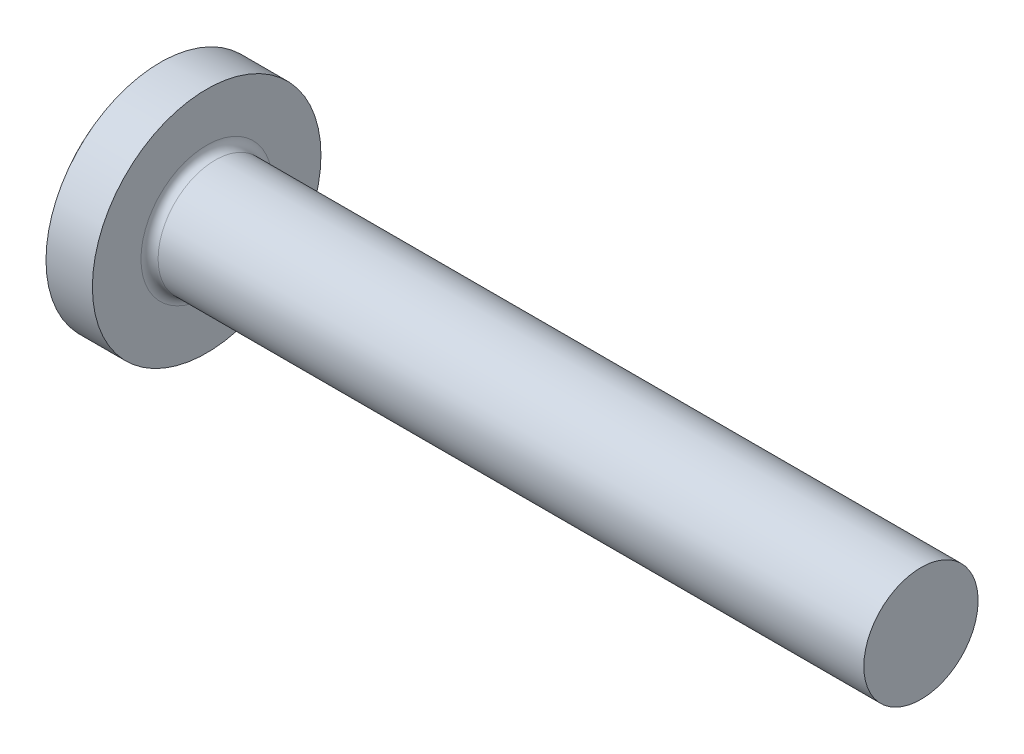
ISO-10303-21;
HEADER;
FILE_DESCRIPTION(('STEP AP214'),'2;1');
FILE_NAME('part.step','',(''),(''),'','','');
FILE_SCHEMA(('AUTOMOTIVE_DESIGN { 1 0 10303 214 1 1 1 1 }'));
ENDSEC;
DATA;
#1=APPLICATION_CONTEXT('core data for automotive mechanical design processes');
#2=APPLICATION_PROTOCOL_DEFINITION('international standard','automotive_design',2000,#1);
#3=PRODUCT_CONTEXT('',#1,'mechanical');
#4=PRODUCT('Part','Part','',(#3));
#5=PRODUCT_RELATED_PRODUCT_CATEGORY('part','',(#4));
#6=PRODUCT_DEFINITION_FORMATION('','',#4);
#7=PRODUCT_DEFINITION_CONTEXT('part definition',#1,'design');
#8=PRODUCT_DEFINITION('design','',#6,#7);
#9=PRODUCT_DEFINITION_SHAPE('','',#8);
#10=(LENGTH_UNIT() NAMED_UNIT(*) SI_UNIT(.MILLI.,.METRE.));
#11=(NAMED_UNIT(*) PLANE_ANGLE_UNIT() SI_UNIT($,.RADIAN.));
#12=(NAMED_UNIT(*) SI_UNIT($,.STERADIAN.) SOLID_ANGLE_UNIT());
#13=UNCERTAINTY_MEASURE_WITH_UNIT(LENGTH_MEASURE(1.E-05),#10,'distance_accuracy_value','');
#14=(GEOMETRIC_REPRESENTATION_CONTEXT(3) GLOBAL_UNCERTAINTY_ASSIGNED_CONTEXT((#13)) GLOBAL_UNIT_ASSIGNED_CONTEXT((#10,
#11,#12)) REPRESENTATION_CONTEXT('',''));
#15=CARTESIAN_POINT('',(0.,0.,0.));
#16=DIRECTION('',(0.,0.,1.));
#17=DIRECTION('',(1.,0.,0.));
#18=AXIS2_PLACEMENT_3D('',#15,#16,#17);
#19=CARTESIAN_POINT('',(13.,0.,0.));
#20=DIRECTION('',(-1.,0.,0.));
#21=DIRECTION('',(0.,1.,0.));
#22=AXIS2_PLACEMENT_3D('',#19,#20,#21);
#23=SPHERICAL_SURFACE('',#22,13.);
#24=CARTESIAN_POINT('',(2.7530492340404,0.,0.));
#25=DIRECTION('',(-1.,0.,0.));
#26=DIRECTION('',(0.,0.,1.));
#27=AXIS2_PLACEMENT_3D('',#24,#25,#26);
#28=CIRCLE('',#27,8.);
#29=CARTESIAN_POINT('',(2.7530492340404,0.,8.));
#30=VERTEX_POINT('',#29);
#31=EDGE_CURVE('E820',#30,#30,#28,.T.);
#32=ORIENTED_EDGE('',*,*,#31,.T.);
#33=EDGE_LOOP('',(#32));
#34=FACE_BOUND('',#33,.T.);
#35=CARTESIAN_POINT('',(0.173606813349381,0.,0.));
#36=DIRECTION('',(1.,0.,0.));
#37=DIRECTION('',(0.,0.,-1.));
#38=AXIS2_PLACEMENT_3D('',#35,#36,#37);
#39=CIRCLE('',#38,2.11746022901081);
#40=CARTESIAN_POINT('',(0.173606813349539,-0.967999999999993,-1.88324555527021));
#41=VERTEX_POINT('',#40);
#42=CARTESIAN_POINT('',(0.173606813349381,-1.88324555526955,-0.968));
#43=VERTEX_POINT('',#42);
#44=EDGE_CURVE('E621',#41,#43,#39,.F.);
#45=ORIENTED_EDGE('',*,*,#44,.F.);
#46=CARTESIAN_POINT('',(13.,-0.968000000000001,0.));
#47=DIRECTION('',(0.,1.,0.));
#48=DIRECTION('',(0.,0.,1.));
#49=AXIS2_PLACEMENT_3D('',#46,#47,#48);
#50=CIRCLE('',#49,12.9639105211352);
#51=CARTESIAN_POINT('',(0.687351995855913,-0.967999999999985,-4.05729899391783));
#52=VERTEX_POINT('',#51);
#53=EDGE_CURVE('E530',#52,#41,#50,.T.);
#54=ORIENTED_EDGE('',*,*,#53,.F.);
#55=CARTESIAN_POINT('',(12.1687962890756,0.,1.66713700726554));
#56=DIRECTION('',(-0.446197753347436,0.,0.894934391398443));
#57=DIRECTION('',(0.894934391398443,0.,0.446197753347436));
#58=AXIS2_PLACEMENT_3D('',#55,#56,#57);
#59=CIRCLE('',#58,12.8658367232742);
#60=CARTESIAN_POINT('',(0.687351995855914,0.968000000000017,-4.05729899391782));
#61=VERTEX_POINT('',#60);
#62=EDGE_CURVE('E61',#61,#52,#59,.T.);
#63=ORIENTED_EDGE('',*,*,#62,.F.);
#64=CARTESIAN_POINT('',(13.,0.968,0.));
#65=DIRECTION('',(0.,-1.,0.));
#66=DIRECTION('',(0.,0.,-1.));
#67=AXIS2_PLACEMENT_3D('',#64,#65,#66);
#68=CIRCLE('',#67,12.9639105211352);
#69=CARTESIAN_POINT('',(0.173606813349538,0.968000000000006,-1.8832455552702));
#70=VERTEX_POINT('',#69);
#71=EDGE_CURVE('E522',#70,#61,#68,.T.);
#72=ORIENTED_EDGE('',*,*,#71,.F.);
#73=CARTESIAN_POINT('',(0.173606813349381,1.88324555526955,-0.968));
#74=VERTEX_POINT('',#73);
#75=EDGE_CURVE('E362',#74,#70,#39,.F.);
#76=ORIENTED_EDGE('',*,*,#75,.F.);
#77=CARTESIAN_POINT('',(13.,0.,-0.968));
#78=DIRECTION('',(0.,0.,1.));
#79=DIRECTION('',(1.,0.,0.));
#80=AXIS2_PLACEMENT_3D('',#77,#78,#79);
#81=CIRCLE('',#80,12.9639105211352);
#82=CARTESIAN_POINT('',(0.687351995855913,4.05729899391782,-0.968));
#83=VERTEX_POINT('',#82);
#84=EDGE_CURVE('E636',#83,#74,#81,.T.);
#85=ORIENTED_EDGE('',*,*,#84,.F.);
#86=CARTESIAN_POINT('',(12.1687962890756,-1.66713700726554,0.));
#87=DIRECTION('',(-0.446197753347436,-0.894934391398443,0.));
#88=DIRECTION('',(0.894934391398443,-0.446197753347436,0.));
#89=AXIS2_PLACEMENT_3D('',#86,#87,#88);
#90=CIRCLE('',#89,12.8658367232742);
#91=CARTESIAN_POINT('',(0.687351995855913,4.05729899391782,0.968000000000001));
#92=VERTEX_POINT('',#91);
#93=EDGE_CURVE('E637',#92,#83,#90,.T.);
#94=ORIENTED_EDGE('',*,*,#93,.F.);
#95=CARTESIAN_POINT('',(13.,0.,0.968000000000001));
#96=DIRECTION('',(0.,0.,-1.));
#97=DIRECTION('',(0.,1.,0.));
#98=AXIS2_PLACEMENT_3D('',#95,#96,#97);
#99=CIRCLE('',#98,12.9639105211352);
#100=CARTESIAN_POINT('',(0.173606813349381,1.88324555526955,0.968));
#101=VERTEX_POINT('',#100);
#102=EDGE_CURVE('E77',#101,#92,#99,.T.);
#103=ORIENTED_EDGE('',*,*,#102,.F.);
#104=CARTESIAN_POINT('',(0.173606813349538,0.967999999999993,1.88324555527021));
#105=VERTEX_POINT('',#104);
#106=EDGE_CURVE('E598',#105,#101,#39,.F.);
#107=ORIENTED_EDGE('',*,*,#106,.F.);
#108=CARTESIAN_POINT('',(0.687351995855913,0.967999999999986,4.05729899391783));
#109=VERTEX_POINT('',#108);
#110=EDGE_CURVE('E534',#109,#105,#68,.T.);
#111=ORIENTED_EDGE('',*,*,#110,.F.);
#112=CARTESIAN_POINT('',(12.1687962890756,0.,-1.66713700726554));
#113=DIRECTION('',(-0.446197753347436,0.,-0.894934391398443));
#114=DIRECTION('',(-0.894934391398443,0.,0.446197753347436));
#115=AXIS2_PLACEMENT_3D('',#112,#113,#114);
#116=CIRCLE('',#115,12.8658367232742);
#117=CARTESIAN_POINT('',(0.687351995855913,-0.968000000000015,4.05729899391782));
#118=VERTEX_POINT('',#117);
#119=EDGE_CURVE('E648',#118,#109,#116,.T.);
#120=ORIENTED_EDGE('',*,*,#119,.F.);
#121=CARTESIAN_POINT('',(0.173606813349538,-0.968000000000007,1.8832455552702));
#122=VERTEX_POINT('',#121);
#123=EDGE_CURVE('E533',#122,#118,#50,.T.);
#124=ORIENTED_EDGE('',*,*,#123,.F.);
#125=CARTESIAN_POINT('',(0.173606813349381,-1.88324555526955,0.968));
#126=VERTEX_POINT('',#125);
#127=EDGE_CURVE('E618',#126,#122,#39,.F.);
#128=ORIENTED_EDGE('',*,*,#127,.F.);
#129=CARTESIAN_POINT('',(0.687351995855913,-4.05729899391783,0.968));
#130=VERTEX_POINT('',#129);
#131=EDGE_CURVE('E644',#130,#126,#99,.T.);
#132=ORIENTED_EDGE('',*,*,#131,.F.);
#133=CARTESIAN_POINT('',(12.1687962890756,1.66713700726554,0.));
#134=DIRECTION('',(-0.446197753347436,0.894934391398443,0.));
#135=DIRECTION('',(-0.894934391398443,-0.446197753347436,0.));
#136=AXIS2_PLACEMENT_3D('',#133,#134,#135);
#137=CIRCLE('',#136,12.8658367232742);
#138=CARTESIAN_POINT('',(0.687351995855914,-4.05729899391783,-0.968000000000003));
#139=VERTEX_POINT('',#138);
#140=EDGE_CURVE('E635',#139,#130,#137,.T.);
#141=ORIENTED_EDGE('',*,*,#140,.F.);
#142=EDGE_CURVE('E633',#43,#139,#81,.T.);
#143=ORIENTED_EDGE('',*,*,#142,.F.);
#144=EDGE_LOOP('',(#45,#54,#63,#72,#76,#85,#94,#103,#107,#111,#120,#124,#128,#132,#141,#143));
#145=FACE_BOUND('',#144,.T.);
#146=ADVANCED_FACE('F51',(#34,#145),#23,.T.);
#147=CARTESIAN_POINT('',(4.5,-2.15638313896297,0.968));
#148=DIRECTION('',(0.,0.,-1.));
#149=DIRECTION('',(0.,1.,0.));
#150=AXIS2_PLACEMENT_3D('',#147,#148,#149);
#151=PLANE('',#150);
#152=ORIENTED_EDGE('',*,*,#131,.T.);
#153=CARTESIAN_POINT('',(0.0720547059961137,-1.89122640893653,0.968));
#154=CARTESIAN_POINT('',(0.732028918912308,-1.83935888078676,0.968));
#155=CARTESIAN_POINT('',(1.39197285175075,-1.78709528516952,0.968));
#156=CARTESIAN_POINT('',(2.71176705862593,-1.68141781212679,0.968));
#157=CARTESIAN_POINT('',(3.37161733286393,-1.6280039372122,0.968));
#158=CARTESIAN_POINT('',(4.18767399058989,-1.56100620694025,0.968));
#159=CARTESIAN_POINT('',(4.34393883769125,-1.54813436282608,0.968));
#160=CARTESIAN_POINT('',(4.5002,-1.53521782402407,0.968));
#161=B_SPLINE_CURVE_WITH_KNOTS('',3,(#153,#154,#155,#156,#157,#158,#159,#160),.UNSPECIFIED.,.F.,
.F.,(4,2,2,4),(0.,1.98602890906563,3.97205348334277,4.44243574058084),.UNSPECIFIED.);
#162=CARTESIAN_POINT('',(4.5,-1.5352343573197,0.968));
#163=VERTEX_POINT('',#162);
#164=EDGE_CURVE('E622',#126,#163,#161,.T.);
#165=ORIENTED_EDGE('',*,*,#164,.T.);
#166=DIRECTION('',(0.,-1.,0.));
#167=VECTOR('',#166,1.);
#168=CARTESIAN_POINT('',(4.5,2.15638313896297,0.968000000000001));
#169=LINE('',#168,#167);
#170=CARTESIAN_POINT('',(4.5,-2.15638313896297,0.968));
#171=VERTEX_POINT('',#170);
#172=EDGE_CURVE('E411',#163,#171,#169,.T.);
#173=ORIENTED_EDGE('',*,*,#172,.T.);
#174=DIRECTION('',(0.894934391398443,0.446197753347436,0.));
#175=VECTOR('',#174,1.);
#176=CARTESIAN_POINT('',(0.,-4.4,0.967999999999999));
#177=LINE('',#176,#175);
#178=EDGE_CURVE('E546',#130,#171,#177,.T.);
#179=ORIENTED_EDGE('',*,*,#178,.F.);
#180=EDGE_LOOP('',(#152,#165,#173,#179));
#181=FACE_BOUND('',#180,.T.);
#182=ADVANCED_FACE('F181',(#181),#151,.T.);
#183=CARTESIAN_POINT('',(4.5,2.15638313896297,0.968000000000001));
#184=VERTEX_POINT('',#183);
#185=CARTESIAN_POINT('',(4.5,1.53523435731905,0.968000000001024));
#186=VERTEX_POINT('',#185);
#187=EDGE_CURVE('E565',#184,#186,#169,.T.);
#188=ORIENTED_EDGE('',*,*,#187,.T.);
#189=CARTESIAN_POINT('',(4.5002,1.53521782402407,0.968000000000001));
#190=CARTESIAN_POINT('',(3.93659640366628,1.58179235233542,0.968000000000001));
#191=CARTESIAN_POINT('',(3.37294640819055,1.62780041478212,0.968));
#192=CARTESIAN_POINT('',(2.24557180441728,1.71888378981729,0.968));
#193=CARTESIAN_POINT('',(1.68184719622633,1.76395910372407,0.968));
#194=CARTESIAN_POINT('',(0.769424365055938,1.8363197908387,0.968));
#195=CARTESIAN_POINT('',(0.420744055536622,1.86383129860306,0.968));
#196=CARTESIAN_POINT('',(0.0720547059961137,1.89122640893653,0.968));
#197=B_SPLINE_CURVE_WITH_KNOTS('',3,(#189,#190,#191,#192,#193,#194,#195,#196),.UNSPECIFIED.,.F.,
.F.,(4,2,2,4),(0.,1.69657324580137,3.3931440935687,4.44243584475656),.UNSPECIFIED.);
#198=EDGE_CURVE('E617',#186,#101,#197,.T.);
#199=ORIENTED_EDGE('',*,*,#198,.T.);
#200=ORIENTED_EDGE('',*,*,#102,.T.);
#201=DIRECTION('',(0.894934391398443,-0.446197753347436,0.));
#202=VECTOR('',#201,1.);
#203=CARTESIAN_POINT('',(0.,4.4,0.968000000000001));
#204=LINE('',#203,#202);
#205=EDGE_CURVE('E543',#92,#184,#204,.T.);
#206=ORIENTED_EDGE('',*,*,#205,.T.);
#207=EDGE_LOOP('',(#188,#199,#200,#206));
#208=FACE_BOUND('',#207,.T.);
#209=ADVANCED_FACE('F186',(#208),#151,.T.);
#210=CARTESIAN_POINT('',(4.5,2.15638313896297,-0.968));
#211=DIRECTION('',(0.,0.,1.));
#212=DIRECTION('',(1.,0.,0.));
#213=AXIS2_PLACEMENT_3D('',#210,#211,#212);
#214=PLANE('',#213);
#215=DIRECTION('',(0.,1.,0.));
#216=VECTOR('',#215,1.);
#217=CARTESIAN_POINT('',(4.5,2.15638313896297,-0.968));
#218=LINE('',#217,#216);
#219=CARTESIAN_POINT('',(4.5,-2.15638313896297,-0.968));
#220=VERTEX_POINT('',#219);
#221=CARTESIAN_POINT('',(4.5,-1.53523435731905,-0.968000000001023));
#222=VERTEX_POINT('',#221);
#223=EDGE_CURVE('E563',#220,#222,#218,.T.);
#224=ORIENTED_EDGE('',*,*,#223,.T.);
#225=CARTESIAN_POINT('',(4.5002,-1.53521782402407,-0.968));
#226=CARTESIAN_POINT('',(3.93659640366628,-1.58179235233542,-0.968));
#227=CARTESIAN_POINT('',(3.37294640819055,-1.62780041478212,-0.968));
#228=CARTESIAN_POINT('',(2.24557180441728,-1.71888378981729,-0.968));
#229=CARTESIAN_POINT('',(1.68184719622633,-1.76395910372407,-0.968));
#230=CARTESIAN_POINT('',(0.769424365055938,-1.8363197908387,-0.968));
#231=CARTESIAN_POINT('',(0.420744055536622,-1.86383129860306,-0.968));
#232=CARTESIAN_POINT('',(0.0720547059961137,-1.89122640893653,-0.968));
#233=B_SPLINE_CURVE_WITH_KNOTS('',3,(#225,#226,#227,#228,#229,#230,#231,#232),.UNSPECIFIED.,.F.,
.F.,(4,2,2,4),(0.,1.69657324580137,3.3931440935687,4.44243584475656),.UNSPECIFIED.);
#234=EDGE_CURVE('E626',#222,#43,#233,.T.);
#235=ORIENTED_EDGE('',*,*,#234,.T.);
#236=ORIENTED_EDGE('',*,*,#142,.T.);
#237=DIRECTION('',(0.894934391398443,0.446197753347436,0.));
#238=VECTOR('',#237,1.);
#239=CARTESIAN_POINT('',(0.,-4.4,-0.968000000000001));
#240=LINE('',#239,#238);
#241=EDGE_CURVE('E542',#139,#220,#240,.T.);
#242=ORIENTED_EDGE('',*,*,#241,.T.);
#243=EDGE_LOOP('',(#224,#235,#236,#242));
#244=FACE_BOUND('',#243,.T.);
#245=ADVANCED_FACE('F371',(#244),#214,.T.);
#246=ORIENTED_EDGE('',*,*,#84,.T.);
#247=CARTESIAN_POINT('',(0.0720547059961137,1.89122640893653,-0.968));
#248=CARTESIAN_POINT('',(0.732028918912308,1.83935888078676,-0.968));
#249=CARTESIAN_POINT('',(1.39197285175075,1.78709528516952,-0.968));
#250=CARTESIAN_POINT('',(2.71176705862593,1.68141781212679,-0.968));
#251=CARTESIAN_POINT('',(3.37161733286393,1.6280039372122,-0.968));
#252=CARTESIAN_POINT('',(4.18767399058989,1.56100620694025,-0.968));
#253=CARTESIAN_POINT('',(4.34393883769125,1.54813436282608,-0.968));
#254=CARTESIAN_POINT('',(4.5002,1.53521782402407,-0.968));
#255=B_SPLINE_CURVE_WITH_KNOTS('',3,(#247,#248,#249,#250,#251,#252,#253,#254),.UNSPECIFIED.,.F.,
.F.,(4,2,2,4),(0.,1.98602890906563,3.97205348334277,4.44243574058084),.UNSPECIFIED.);
#256=CARTESIAN_POINT('',(4.5,1.5352343573197,-0.968));
#257=VERTEX_POINT('',#256);
#258=EDGE_CURVE('E359',#74,#257,#255,.T.);
#259=ORIENTED_EDGE('',*,*,#258,.T.);
#260=CARTESIAN_POINT('',(4.5,2.15638313896297,-0.968));
#261=VERTEX_POINT('',#260);
#262=EDGE_CURVE('E399',#257,#261,#218,.T.);
#263=ORIENTED_EDGE('',*,*,#262,.T.);
#264=DIRECTION('',(0.894934391398443,-0.446197753347436,0.));
#265=VECTOR('',#264,1.);
#266=CARTESIAN_POINT('',(0.,4.4,-0.968));
#267=LINE('',#266,#265);
#268=EDGE_CURVE('E540',#83,#261,#267,.T.);
#269=ORIENTED_EDGE('',*,*,#268,.F.);
#270=EDGE_LOOP('',(#246,#259,#263,#269));
#271=FACE_BOUND('',#270,.T.);
#272=ADVANCED_FACE('F214',(#271),#214,.T.);
#273=CARTESIAN_POINT('',(4.5,-2.15638313896297,0.968));
#274=DIRECTION('',(1.,0.,0.));
#275=DIRECTION('',(0.,0.,-1.));
#276=AXIS2_PLACEMENT_3D('',#273,#274,#275);
#277=PLANE('',#276);
#278=CARTESIAN_POINT('',(4.5,0.,0.));
#279=DIRECTION('',(-1.,0.,0.));
#280=DIRECTION('',(0.,0.,1.));
#281=AXIS2_PLACEMENT_3D('',#278,#279,#280);
#282=CIRCLE('',#281,1.81492934625424);
#283=EDGE_CURVE('E574',#222,#163,#282,.T.);
#284=ORIENTED_EDGE('',*,*,#283,.F.);
#285=ORIENTED_EDGE('',*,*,#223,.F.);
#286=DIRECTION('',(0.,0.,-1.));
#287=VECTOR('',#286,1.);
#288=CARTESIAN_POINT('',(4.5,-2.15638313896297,0.968));
#289=LINE('',#288,#287);
#290=EDGE_CURVE('E430',#171,#220,#289,.T.);
#291=ORIENTED_EDGE('',*,*,#290,.F.);
#292=ORIENTED_EDGE('',*,*,#172,.F.);
#293=EDGE_LOOP('',(#284,#285,#291,#292));
#294=FACE_BOUND('',#293,.T.);
#295=ADVANCED_FACE('F209',(#294),#277,.F.);
#296=CARTESIAN_POINT('',(4.5,-0.968000000000006,1.5352343573197));
#297=VERTEX_POINT('',#296);
#298=CARTESIAN_POINT('',(4.5,0.967999999999994,1.5352343573197));
#299=VERTEX_POINT('',#298);
#300=EDGE_CURVE('E590',#297,#299,#282,.T.);
#301=ORIENTED_EDGE('',*,*,#300,.F.);
#302=DIRECTION('',(0.,0.,-1.));
#303=VECTOR('',#302,1.);
#304=CARTESIAN_POINT('',(4.5,-0.968000000000008,2.15638313896296));
#305=LINE('',#304,#303);
#306=CARTESIAN_POINT('',(4.5,-0.968000000000008,2.15638313896296));
#307=VERTEX_POINT('',#306);
#308=EDGE_CURVE('E55',#307,#297,#305,.T.);
#309=ORIENTED_EDGE('',*,*,#308,.F.);
#310=DIRECTION('',(0.,-1.,0.));
#311=VECTOR('',#310,1.);
#312=CARTESIAN_POINT('',(4.5,-0.968000000000008,2.15638313896296));
#313=LINE('',#312,#311);
#314=CARTESIAN_POINT('',(4.5,0.967999999999992,2.15638313896297));
#315=VERTEX_POINT('',#314);
#316=EDGE_CURVE('E503',#315,#307,#313,.T.);
#317=ORIENTED_EDGE('',*,*,#316,.F.);
#318=DIRECTION('',(0.,0.,1.));
#319=VECTOR('',#318,1.);
#320=CARTESIAN_POINT('',(4.5,0.967999999999992,2.15638313896297));
#321=LINE('',#320,#319);
#322=EDGE_CURVE('E288',#299,#315,#321,.T.);
#323=ORIENTED_EDGE('',*,*,#322,.F.);
#324=EDGE_LOOP('',(#301,#309,#317,#323));
#325=FACE_BOUND('',#324,.T.);
#326=ADVANCED_FACE('F213',(#325),#277,.F.);
#327=EDGE_CURVE('E568',#186,#257,#282,.T.);
#328=ORIENTED_EDGE('',*,*,#327,.F.);
#329=ORIENTED_EDGE('',*,*,#187,.F.);
#330=DIRECTION('',(0.,0.,1.));
#331=VECTOR('',#330,1.);
#332=CARTESIAN_POINT('',(4.5,2.15638313896297,0.968000000000001));
#333=LINE('',#332,#331);
#334=EDGE_CURVE('E553',#261,#184,#333,.T.);
#335=ORIENTED_EDGE('',*,*,#334,.F.);
#336=ORIENTED_EDGE('',*,*,#262,.F.);
#337=EDGE_LOOP('',(#328,#329,#335,#336));
#338=FACE_BOUND('',#337,.T.);
#339=ADVANCED_FACE('F566',(#338),#277,.F.);
#340=CARTESIAN_POINT('',(4.5,0.968000000000005,-1.5352343573197));
#341=VERTEX_POINT('',#340);
#342=CARTESIAN_POINT('',(4.5,-0.967999999999995,-1.5352343573197));
#343=VERTEX_POINT('',#342);
#344=EDGE_CURVE('E499',#341,#343,#282,.T.);
#345=ORIENTED_EDGE('',*,*,#344,.F.);
#346=CARTESIAN_POINT('',(4.5,0.968000000000007,-2.15638313896296));
#347=VERTEX_POINT('',#346);
#348=EDGE_CURVE('E496',#347,#341,#321,.T.);
#349=ORIENTED_EDGE('',*,*,#348,.F.);
#350=DIRECTION('',(0.,1.,0.));
#351=VECTOR('',#350,1.);
#352=CARTESIAN_POINT('',(4.5,-0.967999999999993,-2.15638313896297));
#353=LINE('',#352,#351);
#354=CARTESIAN_POINT('',(4.5,-0.967999999999993,-2.15638313896297));
#355=VERTEX_POINT('',#354);
#356=EDGE_CURVE('E497',#355,#347,#353,.T.);
#357=ORIENTED_EDGE('',*,*,#356,.F.);
#358=EDGE_CURVE('E361',#343,#355,#305,.T.);
#359=ORIENTED_EDGE('',*,*,#358,.F.);
#360=EDGE_LOOP('',(#345,#349,#357,#359));
#361=FACE_BOUND('',#360,.T.);
#362=ADVANCED_FACE('F216',(#361),#277,.F.);
#363=CARTESIAN_POINT('',(4.5,0.967999999999992,2.15638313896297));
#364=DIRECTION('',(0.,-1.,0.));
#365=DIRECTION('',(1.,0.,0.));
#366=AXIS2_PLACEMENT_3D('',#363,#364,#365);
#367=PLANE('',#366);
#368=ORIENTED_EDGE('',*,*,#348,.T.);
#369=CARTESIAN_POINT('',(4.5002,0.968000000000005,-1.53521782402406));
#370=CARTESIAN_POINT('',(3.93659640366628,0.968000000000005,-1.58179235233542));
#371=CARTESIAN_POINT('',(3.37294640819055,0.968000000000005,-1.62780041478212));
#372=CARTESIAN_POINT('',(2.24557180441728,0.968000000000006,-1.71888378981729));
#373=CARTESIAN_POINT('',(1.68184719622632,0.968000000000006,-1.76395910372407));
#374=CARTESIAN_POINT('',(0.769424365055938,0.968000000000006,-1.8363197908387));
#375=CARTESIAN_POINT('',(0.420744055536622,0.968000000000006,-1.86383129860306));
#376=CARTESIAN_POINT('',(0.0720547059961137,0.968000000000006,-1.89122640893653));
#377=B_SPLINE_CURVE_WITH_KNOTS('',3,(#369,#370,#371,#372,#373,#374,#375,#376),.UNSPECIFIED.,.F.,
.F.,(4,2,2,4),(0.,1.69657324580137,3.3931440935687,4.44243584475656),.UNSPECIFIED.);
#378=EDGE_CURVE('E358',#341,#70,#377,.T.);
#379=ORIENTED_EDGE('',*,*,#378,.T.);
#380=ORIENTED_EDGE('',*,*,#71,.T.);
#381=DIRECTION('',(0.894934391398443,0.,0.446197753347436));
#382=VECTOR('',#381,1.);
#383=CARTESIAN_POINT('',(0.,0.968000000000016,-4.4));
#384=LINE('',#383,#382);
#385=EDGE_CURVE('E508',#61,#347,#384,.T.);
#386=ORIENTED_EDGE('',*,*,#385,.T.);
#387=EDGE_LOOP('',(#368,#379,#380,#386));
#388=FACE_BOUND('',#387,.T.);
#389=ADVANCED_FACE('F299',(#388),#367,.T.);
#390=CARTESIAN_POINT('',(4.5,-0.967999999999993,-2.15638313896297));
#391=DIRECTION('',(0.,1.,0.));
#392=DIRECTION('',(0.,0.,1.));
#393=AXIS2_PLACEMENT_3D('',#390,#391,#392);
#394=PLANE('',#393);
#395=ORIENTED_EDGE('',*,*,#53,.T.);
#396=CARTESIAN_POINT('',(0.0720547059961137,-0.967999999999993,-1.89122640893653));
#397=CARTESIAN_POINT('',(0.732028918912308,-0.967999999999994,-1.83935888078676));
#398=CARTESIAN_POINT('',(1.39197285175075,-0.967999999999994,-1.78709528516953));
#399=CARTESIAN_POINT('',(2.71176705862593,-0.967999999999994,-1.6814178121268));
#400=CARTESIAN_POINT('',(3.37161733286393,-0.967999999999994,-1.6280039372122));
#401=CARTESIAN_POINT('',(4.18767399058989,-0.967999999999995,-1.56100620694026));
#402=CARTESIAN_POINT('',(4.34393883769125,-0.967999999999995,-1.54813436282609));
#403=CARTESIAN_POINT('',(4.5002,-0.967999999999995,-1.53521782402407));
#404=B_SPLINE_CURVE_WITH_KNOTS('',3,(#396,#397,#398,#399,#400,#401,#402,#403),.UNSPECIFIED.,.F.,
.F.,(4,2,2,4),(0.,1.98602890906563,3.97205348334277,4.44243574058084),.UNSPECIFIED.);
#405=EDGE_CURVE('E625',#41,#343,#404,.T.);
#406=ORIENTED_EDGE('',*,*,#405,.T.);
#407=ORIENTED_EDGE('',*,*,#358,.T.);
#408=DIRECTION('',(0.894934391398443,0.,0.446197753347436));
#409=VECTOR('',#408,1.);
#410=CARTESIAN_POINT('',(0.,-0.967999999999984,-4.4));
#411=LINE('',#410,#409);
#412=EDGE_CURVE('E511',#52,#355,#411,.T.);
#413=ORIENTED_EDGE('',*,*,#412,.F.);
#414=EDGE_LOOP('',(#395,#406,#407,#413));
#415=FACE_BOUND('',#414,.T.);
#416=ADVANCED_FACE('F467',(#415),#394,.T.);
#417=ORIENTED_EDGE('',*,*,#308,.T.);
#418=CARTESIAN_POINT('',(4.5002,-0.968000000000006,1.53521782402406));
#419=CARTESIAN_POINT('',(3.93659640366628,-0.968000000000006,1.58179235233542));
#420=CARTESIAN_POINT('',(3.37294640819055,-0.968000000000006,1.62780041478211));
#421=CARTESIAN_POINT('',(2.24557180441728,-0.968000000000006,1.71888378981729));
#422=CARTESIAN_POINT('',(1.68184719622633,-0.968000000000007,1.76395910372407));
#423=CARTESIAN_POINT('',(0.769424365055938,-0.968000000000007,1.8363197908387));
#424=CARTESIAN_POINT('',(0.420744055536622,-0.968000000000007,1.86383129860306));
#425=CARTESIAN_POINT('',(0.0720547059961137,-0.968000000000007,1.89122640893653));
#426=B_SPLINE_CURVE_WITH_KNOTS('',3,(#418,#419,#420,#421,#422,#423,#424,#425),.UNSPECIFIED.,.F.,
.F.,(4,2,2,4),(0.,1.69657324580137,3.3931440935687,4.44243584475656),.UNSPECIFIED.);
#427=EDGE_CURVE('E620',#297,#122,#426,.T.);
#428=ORIENTED_EDGE('',*,*,#427,.T.);
#429=ORIENTED_EDGE('',*,*,#123,.T.);
#430=DIRECTION('',(0.894934391398443,0.,-0.446197753347436));
#431=VECTOR('',#430,1.);
#432=CARTESIAN_POINT('',(0.,-0.968000000000016,4.4));
#433=LINE('',#432,#431);
#434=EDGE_CURVE('E520',#118,#307,#433,.T.);
#435=ORIENTED_EDGE('',*,*,#434,.T.);
#436=EDGE_LOOP('',(#417,#428,#429,#435));
#437=FACE_BOUND('',#436,.T.);
#438=ADVANCED_FACE('F475',(#437),#394,.T.);
#439=ORIENTED_EDGE('',*,*,#110,.T.);
#440=CARTESIAN_POINT('',(0.0720547059961137,0.967999999999993,1.89122640893653));
#441=CARTESIAN_POINT('',(0.732028918912308,0.967999999999993,1.83935888078676));
#442=CARTESIAN_POINT('',(1.39197285175075,0.967999999999994,1.78709528516952));
#443=CARTESIAN_POINT('',(2.71176705862593,0.967999999999994,1.6814178121268));
#444=CARTESIAN_POINT('',(3.37161733286393,0.967999999999994,1.6280039372122));
#445=CARTESIAN_POINT('',(4.18767399058989,0.967999999999994,1.56100620694026));
#446=CARTESIAN_POINT('',(4.34393883769125,0.967999999999994,1.54813436282609));
#447=CARTESIAN_POINT('',(4.5002,0.967999999999994,1.53521782402407));
#448=B_SPLINE_CURVE_WITH_KNOTS('',3,(#440,#441,#442,#443,#444,#445,#446,#447),.UNSPECIFIED.,.F.,
.F.,(4,2,2,4),(0.,1.98602890906563,3.97205348334277,4.44243574058084),.UNSPECIFIED.);
#449=EDGE_CURVE('E12',#105,#299,#448,.T.);
#450=ORIENTED_EDGE('',*,*,#449,.T.);
#451=ORIENTED_EDGE('',*,*,#322,.T.);
#452=DIRECTION('',(0.894934391398443,0.,-0.446197753347436));
#453=VECTOR('',#452,1.);
#454=CARTESIAN_POINT('',(0.,0.967999999999984,4.4));
#455=LINE('',#454,#453);
#456=EDGE_CURVE('E517',#109,#315,#455,.T.);
#457=ORIENTED_EDGE('',*,*,#456,.F.);
#458=EDGE_LOOP('',(#439,#450,#451,#457));
#459=FACE_BOUND('',#458,.T.);
#460=ADVANCED_FACE('F196',(#459),#367,.T.);
#461=CARTESIAN_POINT('',(56.,4.,0.));
#462=DIRECTION('',(-1.,0.,0.));
#463=DIRECTION('',(0.,0.,1.));
#464=AXIS2_PLACEMENT_3D('',#461,#462,#463);
#465=PLANE('',#464);
#466=CARTESIAN_POINT('',(56.,0.,0.));
#467=DIRECTION('',(-1.,0.,0.));
#468=DIRECTION('',(0.,0.,1.));
#469=AXIS2_PLACEMENT_3D('',#466,#467,#468);
#470=CIRCLE('',#469,4.);
#471=CARTESIAN_POINT('',(56.,0.,4.));
#472=VERTEX_POINT('',#471);
#473=EDGE_CURVE('E813',#472,#472,#470,.T.);
#474=ORIENTED_EDGE('',*,*,#473,.F.);
#475=EDGE_LOOP('',(#474));
#476=FACE_BOUND('',#475,.T.);
#477=ADVANCED_FACE('F192',(#476),#465,.F.);
#478=CARTESIAN_POINT('',(0.,0.,0.));
#479=DIRECTION('',(-1.,0.,0.));
#480=DIRECTION('',(0.,0.,1.));
#481=AXIS2_PLACEMENT_3D('',#478,#479,#480);
#482=CYLINDRICAL_SURFACE('',#481,4.);
#483=CARTESIAN_POINT('',(6.6,0.,0.));
#484=DIRECTION('',(-1.,0.,0.));
#485=DIRECTION('',(0.,0.,1.));
#486=AXIS2_PLACEMENT_3D('',#483,#484,#485);
#487=CIRCLE('',#486,4.);
#488=CARTESIAN_POINT('',(6.6,0.,4.));
#489=VERTEX_POINT('',#488);
#490=EDGE_CURVE('E640',#489,#489,#487,.F.);
#491=ORIENTED_EDGE('',*,*,#490,.T.);
#492=EDGE_LOOP('',(#491));
#493=FACE_BOUND('',#492,.T.);
#494=ORIENTED_EDGE('',*,*,#473,.T.);
#495=EDGE_LOOP('',(#494));
#496=FACE_BOUND('',#495,.T.);
#497=ADVANCED_FACE('F195',(#493,#496),#482,.T.);
#498=CARTESIAN_POINT('',(6.,4.,0.));
#499=DIRECTION('',(-1.,0.,0.));
#500=DIRECTION('',(0.,0.,1.));
#501=AXIS2_PLACEMENT_3D('',#498,#499,#500);
#502=PLANE('',#501);
#503=CARTESIAN_POINT('',(6.,0.,0.));
#504=DIRECTION('',(-1.,0.,0.));
#505=DIRECTION('',(0.,0.,1.));
#506=AXIS2_PLACEMENT_3D('',#503,#504,#505);
#507=CIRCLE('',#506,4.6);
#508=CARTESIAN_POINT('',(6.,0.,4.6));
#509=VERTEX_POINT('',#508);
#510=EDGE_CURVE('E812',#509,#509,#507,.T.);
#511=ORIENTED_EDGE('',*,*,#510,.T.);
#512=EDGE_LOOP('',(#511));
#513=FACE_BOUND('',#512,.T.);
#514=CARTESIAN_POINT('',(6.,0.,0.));
#515=DIRECTION('',(-1.,0.,0.));
#516=DIRECTION('',(0.,0.,1.));
#517=AXIS2_PLACEMENT_3D('',#514,#515,#516);
#518=CIRCLE('',#517,8.);
#519=CARTESIAN_POINT('',(6.,0.,8.));
#520=VERTEX_POINT('',#519);
#521=EDGE_CURVE('E816',#520,#520,#518,.T.);
#522=ORIENTED_EDGE('',*,*,#521,.F.);
#523=EDGE_LOOP('',(#522));
#524=FACE_BOUND('',#523,.T.);
#525=ADVANCED_FACE('F200',(#513,#524),#502,.F.);
#526=CARTESIAN_POINT('',(0.,0.,0.));
#527=DIRECTION('',(-1.,0.,0.));
#528=DIRECTION('',(0.,0.,1.));
#529=AXIS2_PLACEMENT_3D('',#526,#527,#528);
#530=CYLINDRICAL_SURFACE('',#529,8.);
#531=ORIENTED_EDGE('',*,*,#31,.F.);
#532=EDGE_LOOP('',(#531));
#533=FACE_BOUND('',#532,.T.);
#534=ORIENTED_EDGE('',*,*,#521,.T.);
#535=EDGE_LOOP('',(#534));
#536=FACE_BOUND('',#535,.T.);
#537=ADVANCED_FACE('F204',(#533,#536),#530,.T.);
#538=CARTESIAN_POINT('',(6.6,0.,0.));
#539=DIRECTION('',(-1.,0.,0.));
#540=DIRECTION('',(0.,0.,1.));
#541=AXIS2_PLACEMENT_3D('',#538,#539,#540);
#542=TOROIDAL_SURFACE('',#541,4.6,0.6);
#543=ORIENTED_EDGE('',*,*,#490,.F.);
#544=EDGE_LOOP('',(#543));
#545=FACE_BOUND('',#544,.T.);
#546=ORIENTED_EDGE('',*,*,#510,.F.);
#547=EDGE_LOOP('',(#546));
#548=FACE_BOUND('',#547,.T.);
#549=ADVANCED_FACE('F53',(#545,#548),#542,.F.);
#550=CARTESIAN_POINT('',(4.5,-2.15638313896297,-0.968));
#551=DIRECTION('',(-0.446197753347436,0.894934391398443,0.));
#552=DIRECTION('',(-0.894934391398443,-0.446197753347436,0.));
#553=AXIS2_PLACEMENT_3D('',#550,#551,#552);
#554=PLANE('',#553);
#555=ORIENTED_EDGE('',*,*,#140,.T.);
#556=ORIENTED_EDGE('',*,*,#178,.T.);
#557=ORIENTED_EDGE('',*,*,#290,.T.);
#558=ORIENTED_EDGE('',*,*,#241,.F.);
#559=EDGE_LOOP('',(#555,#556,#557,#558));
#560=FACE_BOUND('',#559,.T.);
#561=ADVANCED_FACE('F433',(#560),#554,.T.);
#562=CARTESIAN_POINT('',(4.5,2.15638313896297,0.968000000000001));
#563=DIRECTION('',(-0.446197753347436,-0.894934391398443,0.));
#564=DIRECTION('',(0.894934391398443,-0.446197753347436,0.));
#565=AXIS2_PLACEMENT_3D('',#562,#563,#564);
#566=PLANE('',#565);
#567=ORIENTED_EDGE('',*,*,#93,.T.);
#568=ORIENTED_EDGE('',*,*,#268,.T.);
#569=ORIENTED_EDGE('',*,*,#334,.T.);
#570=ORIENTED_EDGE('',*,*,#205,.F.);
#571=EDGE_LOOP('',(#567,#568,#569,#570));
#572=FACE_BOUND('',#571,.T.);
#573=ADVANCED_FACE('F217',(#572),#566,.T.);
#574=CARTESIAN_POINT('',(4.5,0.968000000000007,-2.15638313896296));
#575=DIRECTION('',(-0.446197753347436,0.,0.894934391398443));
#576=DIRECTION('',(-0.894934391398443,0.,-0.446197753347436));
#577=AXIS2_PLACEMENT_3D('',#574,#575,#576);
#578=PLANE('',#577);
#579=ORIENTED_EDGE('',*,*,#62,.T.);
#580=ORIENTED_EDGE('',*,*,#412,.T.);
#581=ORIENTED_EDGE('',*,*,#356,.T.);
#582=ORIENTED_EDGE('',*,*,#385,.F.);
#583=EDGE_LOOP('',(#579,#580,#581,#582));
#584=FACE_BOUND('',#583,.T.);
#585=ADVANCED_FACE('F305',(#584),#578,.T.);
#586=CARTESIAN_POINT('',(4.5,-0.968000000000008,2.15638313896296));
#587=DIRECTION('',(-0.446197753347436,0.,-0.894934391398443));
#588=DIRECTION('',(0.894934391398443,0.,-0.446197753347436));
#589=AXIS2_PLACEMENT_3D('',#586,#587,#588);
#590=PLANE('',#589);
#591=ORIENTED_EDGE('',*,*,#119,.T.);
#592=ORIENTED_EDGE('',*,*,#456,.T.);
#593=ORIENTED_EDGE('',*,*,#316,.T.);
#594=ORIENTED_EDGE('',*,*,#434,.F.);
#595=EDGE_LOOP('',(#591,#592,#593,#594));
#596=FACE_BOUND('',#595,.T.);
#597=ADVANCED_FACE('F441',(#596),#590,.T.);
#598=CARTESIAN_POINT('',(4.5,0.,0.));
#599=DIRECTION('',(-1.,0.,0.));
#600=DIRECTION('',(0.,0.,1.));
#601=AXIS2_PLACEMENT_3D('',#598,#599,#600);
#602=CONICAL_SURFACE('',#601,1.81492934625424,0.0698131700797659);
#603=ORIENTED_EDGE('',*,*,#75,.T.);
#604=ORIENTED_EDGE('',*,*,#378,.F.);
#605=EDGE_CURVE('E608',#257,#341,#282,.T.);
#606=ORIENTED_EDGE('',*,*,#605,.F.);
#607=ORIENTED_EDGE('',*,*,#258,.F.);
#608=EDGE_LOOP('',(#603,#604,#606,#607));
#609=FACE_BOUND('',#608,.T.);
#610=ADVANCED_FACE('F179',(#609),#602,.F.);
#611=EDGE_CURVE('E613',#343,#222,#282,.T.);
#612=ORIENTED_EDGE('',*,*,#611,.F.);
#613=ORIENTED_EDGE('',*,*,#405,.F.);
#614=ORIENTED_EDGE('',*,*,#44,.T.);
#615=ORIENTED_EDGE('',*,*,#234,.F.);
#616=EDGE_LOOP('',(#612,#613,#614,#615));
#617=FACE_BOUND('',#616,.T.);
#618=ADVANCED_FACE('F630',(#617),#602,.F.);
#619=ORIENTED_EDGE('',*,*,#127,.T.);
#620=ORIENTED_EDGE('',*,*,#427,.F.);
#621=EDGE_CURVE('E592',#163,#297,#282,.T.);
#622=ORIENTED_EDGE('',*,*,#621,.F.);
#623=ORIENTED_EDGE('',*,*,#164,.F.);
#624=EDGE_LOOP('',(#619,#620,#622,#623));
#625=FACE_BOUND('',#624,.T.);
#626=ADVANCED_FACE('F177',(#625),#602,.F.);
#627=EDGE_CURVE('E69',#299,#186,#282,.T.);
#628=ORIENTED_EDGE('',*,*,#627,.F.);
#629=ORIENTED_EDGE('',*,*,#449,.F.);
#630=ORIENTED_EDGE('',*,*,#106,.T.);
#631=ORIENTED_EDGE('',*,*,#198,.F.);
#632=EDGE_LOOP('',(#628,#629,#630,#631));
#633=FACE_BOUND('',#632,.T.);
#634=ADVANCED_FACE('F171',(#633),#602,.F.);
#635=CARTESIAN_POINT('',(5.0897062918691,0.,0.));
#636=DIRECTION('',(-1.,0.,0.));
#637=DIRECTION('',(0.,0.,1.));
#638=AXIS2_PLACEMENT_3D('',#635,#636,#637);
#639=CONICAL_SURFACE('',#638,0.,1.25663706143592);
#640=ORIENTED_EDGE('',*,*,#627,.T.);
#641=ORIENTED_EDGE('',*,*,#327,.T.);
#642=ORIENTED_EDGE('',*,*,#605,.T.);
#643=ORIENTED_EDGE('',*,*,#344,.T.);
#644=ORIENTED_EDGE('',*,*,#611,.T.);
#645=ORIENTED_EDGE('',*,*,#283,.T.);
#646=ORIENTED_EDGE('',*,*,#621,.T.);
#647=ORIENTED_EDGE('',*,*,#300,.T.);
#648=EDGE_LOOP('',(#640,#641,#642,#643,#644,#645,#646,#647));
#649=FACE_BOUND('',#648,.T.);
#650=CARTESIAN_POINT('',(5.0897062918691,0.,0.));
#651=VERTEX_POINT('',#650);
#652=VERTEX_LOOP('',#651);
#653=FACE_BOUND('',#652,.T.);
#654=ADVANCED_FACE('F169',(#649,#653),#639,.F.);
#655=CLOSED_SHELL('',(#146,#182,#209,#245,#272,#295,#326,#339,#362,#389,#416,#438,#460,#477,
#497,#525,#537,#549,#561,#573,#585,#597,#610,#618,#626,#634,#654));
#656=MANIFOLD_SOLID_BREP('B2',#655);
#657=ADVANCED_BREP_SHAPE_REPRESENTATION('',(#18,#656),#14);
#658=SHAPE_DEFINITION_REPRESENTATION(#9,#657);
ENDSEC;
END-ISO-10303-21;
